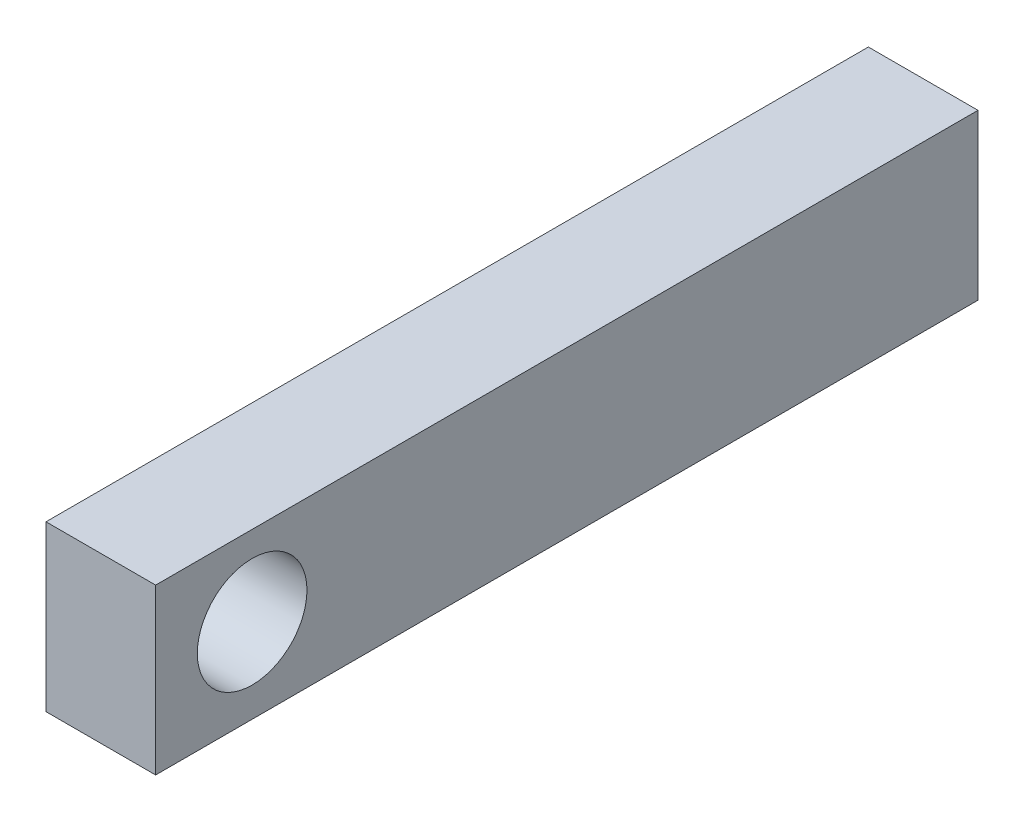
ISO-10303-21;
HEADER;
FILE_DESCRIPTION(('STEP AP214'),'2;1');
FILE_NAME('part.step','',(''),(''),'','','');
FILE_SCHEMA(('AUTOMOTIVE_DESIGN { 1 0 10303 214 1 1 1 1 }'));
ENDSEC;
DATA;
#1=APPLICATION_CONTEXT('core data for automotive mechanical design processes');
#2=APPLICATION_PROTOCOL_DEFINITION('international standard','automotive_design',2000,#1);
#3=PRODUCT_CONTEXT('',#1,'mechanical');
#4=PRODUCT('Part','Part','',(#3));
#5=PRODUCT_RELATED_PRODUCT_CATEGORY('part','',(#4));
#6=PRODUCT_DEFINITION_FORMATION('','',#4);
#7=PRODUCT_DEFINITION_CONTEXT('part definition',#1,'design');
#8=PRODUCT_DEFINITION('design','',#6,#7);
#9=PRODUCT_DEFINITION_SHAPE('','',#8);
#10=(LENGTH_UNIT() NAMED_UNIT(*) SI_UNIT(.MILLI.,.METRE.));
#11=(NAMED_UNIT(*) PLANE_ANGLE_UNIT() SI_UNIT($,.RADIAN.));
#12=(NAMED_UNIT(*) SI_UNIT($,.STERADIAN.) SOLID_ANGLE_UNIT());
#13=UNCERTAINTY_MEASURE_WITH_UNIT(LENGTH_MEASURE(1.E-05),#10,'distance_accuracy_value','');
#14=(GEOMETRIC_REPRESENTATION_CONTEXT(3) GLOBAL_UNCERTAINTY_ASSIGNED_CONTEXT((#13)) GLOBAL_UNIT_ASSIGNED_CONTEXT((#10,
#11,#12)) REPRESENTATION_CONTEXT('',''));
#15=CARTESIAN_POINT('',(0.,0.,0.));
#16=DIRECTION('',(0.,0.,1.));
#17=DIRECTION('',(1.,0.,0.));
#18=AXIS2_PLACEMENT_3D('',#15,#16,#17);
#19=CARTESIAN_POINT('',(-26.1052631578948,3.,-8.42105263157892));
#20=DIRECTION('',(1.,0.,0.));
#21=DIRECTION('',(0.,0.,-1.));
#22=AXIS2_PLACEMENT_3D('',#19,#20,#21);
#23=PLANE('',#22);
#24=CARTESIAN_POINT('',(-26.1052631578948,1.54077955211311,4.81866932833715));
#25=DIRECTION('',(1.,0.,0.));
#26=DIRECTION('',(0.,0.,-1.));
#27=AXIS2_PLACEMENT_3D('',#24,#25,#26);
#28=CIRCLE('',#27,1.);
#29=CARTESIAN_POINT('',(-26.1052631578948,1.54077955211311,3.81866932833715));
#30=VERTEX_POINT('',#29);
#31=EDGE_CURVE('E113',#30,#30,#28,.T.);
#32=ORIENTED_EDGE('',*,*,#31,.T.);
#33=EDGE_LOOP('',(#32));
#34=FACE_BOUND('',#33,.T.);
#35=DIRECTION('',(0.,0.,1.));
#36=VECTOR('',#35,1.);
#37=CARTESIAN_POINT('',(-26.1052631578948,0.,-8.42105263157892));
#38=LINE('',#37,#36);
#39=CARTESIAN_POINT('',(-26.1052631578948,0.,-8.42105263157892));
#40=VERTEX_POINT('',#39);
#41=CARTESIAN_POINT('',(-26.1052631578948,0.,6.57894736842108));
#42=VERTEX_POINT('',#41);
#43=EDGE_CURVE('E100',#40,#42,#38,.T.);
#44=ORIENTED_EDGE('',*,*,#43,.T.);
#45=DIRECTION('',(0.,-1.,0.));
#46=VECTOR('',#45,1.);
#47=CARTESIAN_POINT('',(-26.1052631578948,3.,6.57894736842108));
#48=LINE('',#47,#46);
#49=CARTESIAN_POINT('',(-26.1052631578948,3.,6.57894736842108));
#50=VERTEX_POINT('',#49);
#51=EDGE_CURVE('E11',#50,#42,#48,.T.);
#52=ORIENTED_EDGE('',*,*,#51,.F.);
#53=DIRECTION('',(0.,0.,1.));
#54=VECTOR('',#53,1.);
#55=CARTESIAN_POINT('',(-26.1052631578948,3.,-8.42105263157892));
#56=LINE('',#55,#54);
#57=CARTESIAN_POINT('',(-26.1052631578948,3.,-8.42105263157892));
#58=VERTEX_POINT('',#57);
#59=EDGE_CURVE('E87',#58,#50,#56,.T.);
#60=ORIENTED_EDGE('',*,*,#59,.F.);
#61=DIRECTION('',(0.,-1.,0.));
#62=VECTOR('',#61,1.);
#63=CARTESIAN_POINT('',(-26.1052631578948,3.,-8.42105263157892));
#64=LINE('',#63,#62);
#65=EDGE_CURVE('E96',#58,#40,#64,.T.);
#66=ORIENTED_EDGE('',*,*,#65,.T.);
#67=EDGE_LOOP('',(#44,#52,#60,#66));
#68=FACE_BOUND('',#67,.T.);
#69=ADVANCED_FACE('F35',(#34,#68),#23,.F.);
#70=CARTESIAN_POINT('',(-26.1052631578948,3.,6.57894736842108));
#71=DIRECTION('',(0.,0.,-1.));
#72=DIRECTION('',(-1.,0.,0.));
#73=AXIS2_PLACEMENT_3D('',#70,#71,#72);
#74=PLANE('',#73);
#75=DIRECTION('',(1.,0.,0.));
#76=VECTOR('',#75,1.);
#77=CARTESIAN_POINT('',(-26.1052631578948,0.,6.57894736842108));
#78=LINE('',#77,#76);
#79=CARTESIAN_POINT('',(-24.1052631578948,0.,6.57894736842108));
#80=VERTEX_POINT('',#79);
#81=EDGE_CURVE('E91',#42,#80,#78,.T.);
#82=ORIENTED_EDGE('',*,*,#81,.T.);
#83=DIRECTION('',(0.,-1.,0.));
#84=VECTOR('',#83,1.);
#85=CARTESIAN_POINT('',(-24.1052631578948,3.,6.57894736842108));
#86=LINE('',#85,#84);
#87=CARTESIAN_POINT('',(-24.1052631578948,3.,6.57894736842108));
#88=VERTEX_POINT('',#87);
#89=EDGE_CURVE('E44',#88,#80,#86,.T.);
#90=ORIENTED_EDGE('',*,*,#89,.F.);
#91=DIRECTION('',(1.,0.,0.));
#92=VECTOR('',#91,1.);
#93=CARTESIAN_POINT('',(-26.1052631578948,3.,6.57894736842108));
#94=LINE('',#93,#92);
#95=EDGE_CURVE('E82',#50,#88,#94,.T.);
#96=ORIENTED_EDGE('',*,*,#95,.F.);
#97=ORIENTED_EDGE('',*,*,#51,.T.);
#98=EDGE_LOOP('',(#82,#90,#96,#97));
#99=FACE_BOUND('',#98,.T.);
#100=ADVANCED_FACE('F90',(#99),#74,.F.);
#101=CARTESIAN_POINT('',(-24.1052631578948,3.,-8.42105263157892));
#102=DIRECTION('',(-1.,0.,0.));
#103=DIRECTION('',(0.,0.,1.));
#104=AXIS2_PLACEMENT_3D('',#101,#102,#103);
#105=PLANE('',#104);
#106=CARTESIAN_POINT('',(-24.1052631578948,1.54077955211311,4.81866932833715));
#107=DIRECTION('',(-1.,0.,0.));
#108=DIRECTION('',(0.,0.,1.));
#109=AXIS2_PLACEMENT_3D('',#106,#107,#108);
#110=CIRCLE('',#109,1.);
#111=CARTESIAN_POINT('',(-24.1052631578948,1.54077955211311,5.81866932833715));
#112=VERTEX_POINT('',#111);
#113=EDGE_CURVE('E38',#112,#112,#110,.T.);
#114=ORIENTED_EDGE('',*,*,#113,.T.);
#115=EDGE_LOOP('',(#114));
#116=FACE_BOUND('',#115,.T.);
#117=DIRECTION('',(0.,0.,-1.));
#118=VECTOR('',#117,1.);
#119=CARTESIAN_POINT('',(-24.1052631578948,0.,-8.42105263157892));
#120=LINE('',#119,#118);
#121=CARTESIAN_POINT('',(-24.1052631578948,0.,-8.42105263157892));
#122=VERTEX_POINT('',#121);
#123=EDGE_CURVE('E69',#80,#122,#120,.T.);
#124=ORIENTED_EDGE('',*,*,#123,.T.);
#125=DIRECTION('',(0.,-1.,0.));
#126=VECTOR('',#125,1.);
#127=CARTESIAN_POINT('',(-24.1052631578948,3.,-8.42105263157892));
#128=LINE('',#127,#126);
#129=CARTESIAN_POINT('',(-24.1052631578948,3.,-8.42105263157892));
#130=VERTEX_POINT('',#129);
#131=EDGE_CURVE('E92',#130,#122,#128,.T.);
#132=ORIENTED_EDGE('',*,*,#131,.F.);
#133=DIRECTION('',(0.,0.,-1.));
#134=VECTOR('',#133,1.);
#135=CARTESIAN_POINT('',(-24.1052631578948,3.,-8.42105263157892));
#136=LINE('',#135,#134);
#137=EDGE_CURVE('E85',#88,#130,#136,.T.);
#138=ORIENTED_EDGE('',*,*,#137,.F.);
#139=ORIENTED_EDGE('',*,*,#89,.T.);
#140=EDGE_LOOP('',(#124,#132,#138,#139));
#141=FACE_BOUND('',#140,.T.);
#142=ADVANCED_FACE('F94',(#116,#141),#105,.F.);
#143=CARTESIAN_POINT('',(-26.1052631578948,3.,-8.42105263157892));
#144=DIRECTION('',(0.,0.,1.));
#145=DIRECTION('',(1.,0.,0.));
#146=AXIS2_PLACEMENT_3D('',#143,#144,#145);
#147=PLANE('',#146);
#148=DIRECTION('',(-1.,0.,0.));
#149=VECTOR('',#148,1.);
#150=CARTESIAN_POINT('',(-26.1052631578948,0.,-8.42105263157892));
#151=LINE('',#150,#149);
#152=EDGE_CURVE('E75',#122,#40,#151,.T.);
#153=ORIENTED_EDGE('',*,*,#152,.T.);
#154=ORIENTED_EDGE('',*,*,#65,.F.);
#155=DIRECTION('',(-1.,0.,0.));
#156=VECTOR('',#155,1.);
#157=CARTESIAN_POINT('',(-26.1052631578948,3.,-8.42105263157892));
#158=LINE('',#157,#156);
#159=EDGE_CURVE('E52',#130,#58,#158,.T.);
#160=ORIENTED_EDGE('',*,*,#159,.F.);
#161=ORIENTED_EDGE('',*,*,#131,.T.);
#162=EDGE_LOOP('',(#153,#154,#160,#161));
#163=FACE_BOUND('',#162,.T.);
#164=ADVANCED_FACE('F107',(#163),#147,.F.);
#165=CARTESIAN_POINT('',(0.,3.,0.));
#166=DIRECTION('',(0.,1.,0.));
#167=DIRECTION('',(0.,0.,1.));
#168=AXIS2_PLACEMENT_3D('',#165,#166,#167);
#169=PLANE('',#168);
#170=ORIENTED_EDGE('',*,*,#59,.T.);
#171=ORIENTED_EDGE('',*,*,#95,.T.);
#172=ORIENTED_EDGE('',*,*,#137,.T.);
#173=ORIENTED_EDGE('',*,*,#159,.T.);
#174=EDGE_LOOP('',(#170,#171,#172,#173));
#175=FACE_BOUND('',#174,.T.);
#176=ADVANCED_FACE('F83',(#175),#169,.T.);
#177=CARTESIAN_POINT('',(0.,0.,0.));
#178=DIRECTION('',(0.,1.,0.));
#179=DIRECTION('',(0.,0.,1.));
#180=AXIS2_PLACEMENT_3D('',#177,#178,#179);
#181=PLANE('',#180);
#182=ORIENTED_EDGE('',*,*,#43,.F.);
#183=ORIENTED_EDGE('',*,*,#152,.F.);
#184=ORIENTED_EDGE('',*,*,#123,.F.);
#185=ORIENTED_EDGE('',*,*,#81,.F.);
#186=EDGE_LOOP('',(#182,#183,#184,#185));
#187=FACE_BOUND('',#186,.T.);
#188=ADVANCED_FACE('F110',(#187),#181,.F.);
#189=CARTESIAN_POINT('',(-26.1052631578948,1.54077955211311,4.81866932833715));
#190=DIRECTION('',(1.,0.,0.));
#191=DIRECTION('',(0.,0.,-1.));
#192=AXIS2_PLACEMENT_3D('',#189,#190,#191);
#193=CYLINDRICAL_SURFACE('',#192,1.);
#194=ORIENTED_EDGE('',*,*,#31,.F.);
#195=EDGE_LOOP('',(#194));
#196=FACE_BOUND('',#195,.T.);
#197=ORIENTED_EDGE('',*,*,#113,.F.);
#198=EDGE_LOOP('',(#197));
#199=FACE_BOUND('',#198,.T.);
#200=ADVANCED_FACE('F121',(#196,#199),#193,.F.);
#201=CLOSED_SHELL('',(#69,#100,#142,#164,#176,#188,#200));
#202=MANIFOLD_SOLID_BREP('B2',#201);
#203=ADVANCED_BREP_SHAPE_REPRESENTATION('',(#18,#202),#14);
#204=SHAPE_DEFINITION_REPRESENTATION(#9,#203);
ENDSEC;
END-ISO-10303-21;
